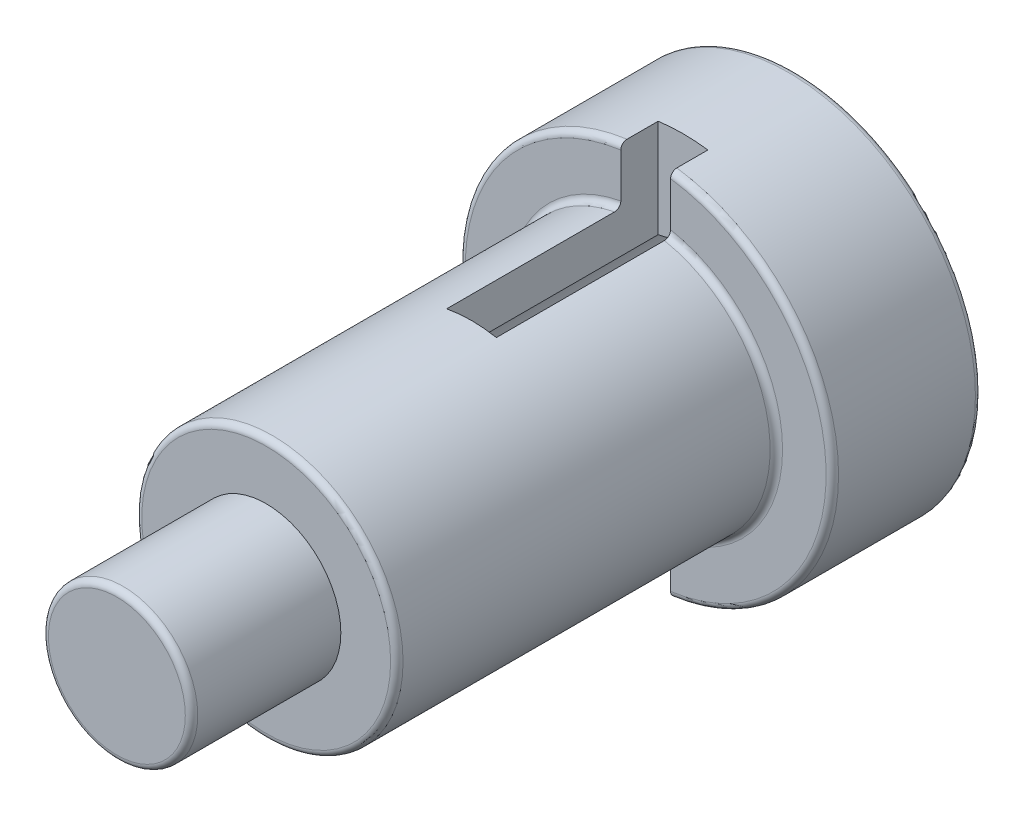
ISO-10303-21;
HEADER;
FILE_DESCRIPTION(('STEP AP214'),'2;1');
FILE_NAME('part.step','',(''),(''),'','','');
FILE_SCHEMA(('AUTOMOTIVE_DESIGN { 1 0 10303 214 1 1 1 1 }'));
ENDSEC;
DATA;
#1=APPLICATION_CONTEXT('core data for automotive mechanical design processes');
#2=APPLICATION_PROTOCOL_DEFINITION('international standard','automotive_design',2000,#1);
#3=PRODUCT_CONTEXT('',#1,'mechanical');
#4=PRODUCT('Part','Part','',(#3));
#5=PRODUCT_RELATED_PRODUCT_CATEGORY('part','',(#4));
#6=PRODUCT_DEFINITION_FORMATION('','',#4);
#7=PRODUCT_DEFINITION_CONTEXT('part definition',#1,'design');
#8=PRODUCT_DEFINITION('design','',#6,#7);
#9=PRODUCT_DEFINITION_SHAPE('','',#8);
#10=(LENGTH_UNIT() NAMED_UNIT(*) SI_UNIT(.MILLI.,.METRE.));
#11=(NAMED_UNIT(*) PLANE_ANGLE_UNIT() SI_UNIT($,.RADIAN.));
#12=(NAMED_UNIT(*) SI_UNIT($,.STERADIAN.) SOLID_ANGLE_UNIT());
#13=UNCERTAINTY_MEASURE_WITH_UNIT(LENGTH_MEASURE(1.E-05),#10,'distance_accuracy_value','');
#14=(GEOMETRIC_REPRESENTATION_CONTEXT(3) GLOBAL_UNCERTAINTY_ASSIGNED_CONTEXT((#13)) GLOBAL_UNIT_ASSIGNED_CONTEXT((#10,
#11,#12)) REPRESENTATION_CONTEXT('',''));
#15=CARTESIAN_POINT('',(0.,0.,0.));
#16=DIRECTION('',(0.,0.,1.));
#17=DIRECTION('',(1.,0.,0.));
#18=AXIS2_PLACEMENT_3D('',#15,#16,#17);
#19=CARTESIAN_POINT('',(0.,0.,-24.));
#20=DIRECTION('',(0.,0.,1.));
#21=DIRECTION('',(1.,0.,0.));
#22=AXIS2_PLACEMENT_3D('',#19,#20,#21);
#23=CYLINDRICAL_SURFACE('',#22,30.);
#24=CARTESIAN_POINT('',(0.,0.,-23.));
#25=DIRECTION('',(0.,0.,1.));
#26=DIRECTION('',(1.,0.,0.));
#27=AXIS2_PLACEMENT_3D('',#24,#25,#26);
#28=CIRCLE('',#27,30.);
#29=CARTESIAN_POINT('',(30.,0.,-23.));
#30=VERTEX_POINT('',#29);
#31=EDGE_CURVE('E259',#30,#30,#28,.T.);
#32=ORIENTED_EDGE('',*,*,#31,.T.);
#33=EDGE_LOOP('',(#32));
#34=FACE_BOUND('',#33,.T.);
#35=DIRECTION('',(0.,0.,1.));
#36=VECTOR('',#35,1.);
#37=CARTESIAN_POINT('',(-4.,-29.732137494637,-24.));
#38=LINE('',#37,#36);
#39=CARTESIAN_POINT('',(-4.,-29.732137494637,-1.));
#40=VERTEX_POINT('',#39);
#41=CARTESIAN_POINT('',(-4.,-29.732137494637,-6.));
#42=VERTEX_POINT('',#41);
#43=EDGE_CURVE('E208',#40,#42,#38,.F.);
#44=ORIENTED_EDGE('',*,*,#43,.F.);
#45=CARTESIAN_POINT('',(0.,0.,-1.));
#46=DIRECTION('',(0.,0.,1.));
#47=DIRECTION('',(1.,0.,0.));
#48=AXIS2_PLACEMENT_3D('',#45,#46,#47);
#49=CIRCLE('',#48,30.);
#50=CARTESIAN_POINT('',(-4.,29.732137494637,-1.));
#51=VERTEX_POINT('',#50);
#52=EDGE_CURVE('E438',#40,#51,#49,.F.);
#53=ORIENTED_EDGE('',*,*,#52,.T.);
#54=DIRECTION('',(0.,0.,1.));
#55=VECTOR('',#54,1.);
#56=CARTESIAN_POINT('',(-4.,29.732137494637,-24.));
#57=LINE('',#56,#55);
#58=CARTESIAN_POINT('',(-4.,29.732137494637,-6.));
#59=VERTEX_POINT('',#58);
#60=EDGE_CURVE('E214',#59,#51,#57,.T.);
#61=ORIENTED_EDGE('',*,*,#60,.F.);
#62=CARTESIAN_POINT('',(0.,0.,-6.00000000000001));
#63=DIRECTION('',(0.,0.,1.));
#64=DIRECTION('',(1.,0.,0.));
#65=AXIS2_PLACEMENT_3D('',#62,#63,#64);
#66=CIRCLE('',#65,30.);
#67=CARTESIAN_POINT('',(4.,29.732137494637,-6.00000000000001));
#68=VERTEX_POINT('',#67);
#69=EDGE_CURVE('E178',#59,#68,#66,.F.);
#70=ORIENTED_EDGE('',*,*,#69,.T.);
#71=DIRECTION('',(0.,0.,1.));
#72=VECTOR('',#71,1.);
#73=CARTESIAN_POINT('',(4.,29.732137494637,-24.));
#74=LINE('',#73,#72);
#75=CARTESIAN_POINT('',(4.,29.732137494637,-1.));
#76=VERTEX_POINT('',#75);
#77=EDGE_CURVE('E202',#68,#76,#74,.T.);
#78=ORIENTED_EDGE('',*,*,#77,.T.);
#79=CARTESIAN_POINT('',(0.,0.,-1.));
#80=DIRECTION('',(0.,0.,1.));
#81=DIRECTION('',(1.,0.,0.));
#82=AXIS2_PLACEMENT_3D('',#79,#80,#81);
#83=CIRCLE('',#82,30.);
#84=CARTESIAN_POINT('',(4.,-29.732137494637,-1.));
#85=VERTEX_POINT('',#84);
#86=EDGE_CURVE('E164',#76,#85,#83,.F.);
#87=ORIENTED_EDGE('',*,*,#86,.T.);
#88=DIRECTION('',(0.,0.,1.));
#89=VECTOR('',#88,1.);
#90=CARTESIAN_POINT('',(4.,-29.732137494637,-24.));
#91=LINE('',#90,#89);
#92=CARTESIAN_POINT('',(4.,-29.732137494637,-6.00000000000001));
#93=VERTEX_POINT('',#92);
#94=EDGE_CURVE('E157',#85,#93,#91,.F.);
#95=ORIENTED_EDGE('',*,*,#94,.T.);
#96=EDGE_CURVE('E160',#93,#42,#66,.F.);
#97=ORIENTED_EDGE('',*,*,#96,.T.);
#98=EDGE_LOOP('',(#44,#53,#61,#70,#78,#87,#95,#97));
#99=FACE_BOUND('',#98,.T.);
#100=ADVANCED_FACE('F39',(#34,#99),#23,.T.);
#101=CARTESIAN_POINT('',(0.,0.,0.));
#102=DIRECTION('',(0.,0.,1.));
#103=DIRECTION('',(1.,0.,0.));
#104=AXIS2_PLACEMENT_3D('',#101,#102,#103);
#105=PLANE('',#104);
#106=DIRECTION('',(0.,-1.,0.));
#107=VECTOR('',#106,1.);
#108=CARTESIAN_POINT('',(4.,0.,0.));
#109=LINE('',#108,#107);
#110=CARTESIAN_POINT('',(4.,-21.6333076527839,0.));
#111=VERTEX_POINT('',#110);
#112=CARTESIAN_POINT('',(4.,-28.7228132326901,0.));
#113=VERTEX_POINT('',#112);
#114=EDGE_CURVE('E168',#111,#113,#109,.T.);
#115=ORIENTED_EDGE('',*,*,#114,.T.);
#116=CARTESIAN_POINT('',(0.,0.,0.));
#117=DIRECTION('',(0.,0.,1.));
#118=DIRECTION('',(1.,0.,0.));
#119=AXIS2_PLACEMENT_3D('',#116,#117,#118);
#120=CIRCLE('',#119,29.);
#121=CARTESIAN_POINT('',(4.,28.7228132326901,0.));
#122=VERTEX_POINT('',#121);
#123=EDGE_CURVE('E437',#113,#122,#120,.T.);
#124=ORIENTED_EDGE('',*,*,#123,.T.);
#125=CARTESIAN_POINT('',(4.,21.6333076527839,0.));
#126=VERTEX_POINT('',#125);
#127=EDGE_CURVE('E198',#122,#126,#109,.T.);
#128=ORIENTED_EDGE('',*,*,#127,.T.);
#129=CARTESIAN_POINT('',(0.,0.,0.));
#130=DIRECTION('',(0.,0.,1.));
#131=DIRECTION('',(1.,0.,0.));
#132=AXIS2_PLACEMENT_3D('',#129,#130,#131);
#133=CIRCLE('',#132,22.);
#134=EDGE_CURVE('E435',#126,#111,#133,.F.);
#135=ORIENTED_EDGE('',*,*,#134,.T.);
#136=EDGE_LOOP('',(#115,#124,#128,#135));
#137=FACE_BOUND('',#136,.T.);
#138=ADVANCED_FACE('F353',(#137),#105,.T.);
#139=CARTESIAN_POINT('',(0.,0.,-24.));
#140=DIRECTION('',(0.,0.,1.));
#141=DIRECTION('',(1.,0.,0.));
#142=AXIS2_PLACEMENT_3D('',#139,#140,#141);
#143=PLANE('',#142);
#144=CARTESIAN_POINT('',(0.,0.,-24.));
#145=DIRECTION('',(0.,0.,1.));
#146=DIRECTION('',(1.,0.,0.));
#147=AXIS2_PLACEMENT_3D('',#144,#145,#146);
#148=CIRCLE('',#147,29.);
#149=CARTESIAN_POINT('',(29.,0.,-24.));
#150=VERTEX_POINT('',#149);
#151=EDGE_CURVE('E339',#150,#150,#148,.F.);
#152=ORIENTED_EDGE('',*,*,#151,.T.);
#153=EDGE_LOOP('',(#152));
#154=FACE_BOUND('',#153,.T.);
#155=CARTESIAN_POINT('',(0.,0.,-24.));
#156=DIRECTION('',(0.,0.,-1.));
#157=DIRECTION('',(-1.,0.,0.));
#158=AXIS2_PLACEMENT_3D('',#155,#156,#157);
#159=CIRCLE('',#158,14.5);
#160=CARTESIAN_POINT('',(-14.5,0.,-24.));
#161=VERTEX_POINT('',#160);
#162=EDGE_CURVE('E225',#161,#161,#159,.T.);
#163=ORIENTED_EDGE('',*,*,#162,.F.);
#164=EDGE_LOOP('',(#163));
#165=FACE_BOUND('',#164,.T.);
#166=ADVANCED_FACE('F359',(#154,#165),#143,.F.);
#167=DIRECTION('',(0.,-1.,0.));
#168=VECTOR('',#167,1.);
#169=CARTESIAN_POINT('',(-4.,0.,0.));
#170=LINE('',#169,#168);
#171=CARTESIAN_POINT('',(-4.,28.7228132326901,0.));
#172=VERTEX_POINT('',#171);
#173=CARTESIAN_POINT('',(-4.,21.6333076527839,0.));
#174=VERTEX_POINT('',#173);
#175=EDGE_CURVE('E209',#172,#174,#170,.T.);
#176=ORIENTED_EDGE('',*,*,#175,.F.);
#177=CARTESIAN_POINT('',(0.,0.,0.));
#178=DIRECTION('',(0.,0.,1.));
#179=DIRECTION('',(1.,0.,0.));
#180=AXIS2_PLACEMENT_3D('',#177,#178,#179);
#181=CIRCLE('',#180,29.);
#182=CARTESIAN_POINT('',(-4.,-28.7228132326901,0.));
#183=VERTEX_POINT('',#182);
#184=EDGE_CURVE('E248',#172,#183,#181,.T.);
#185=ORIENTED_EDGE('',*,*,#184,.T.);
#186=CARTESIAN_POINT('',(-4.,-21.6333076527839,0.));
#187=VERTEX_POINT('',#186);
#188=EDGE_CURVE('E205',#187,#183,#170,.T.);
#189=ORIENTED_EDGE('',*,*,#188,.F.);
#190=CARTESIAN_POINT('',(0.,0.,0.));
#191=DIRECTION('',(0.,0.,1.));
#192=DIRECTION('',(1.,0.,0.));
#193=AXIS2_PLACEMENT_3D('',#190,#191,#192);
#194=CIRCLE('',#193,22.);
#195=EDGE_CURVE('E246',#187,#174,#194,.F.);
#196=ORIENTED_EDGE('',*,*,#195,.T.);
#197=EDGE_LOOP('',(#176,#185,#189,#196));
#198=FACE_BOUND('',#197,.T.);
#199=ADVANCED_FACE('F362',(#198),#105,.T.);
#200=CARTESIAN_POINT('',(0.,0.,61.));
#201=DIRECTION('',(0.,0.,-1.));
#202=DIRECTION('',(-1.,0.,0.));
#203=AXIS2_PLACEMENT_3D('',#200,#201,#202);
#204=CYLINDRICAL_SURFACE('',#203,21.);
#205=CARTESIAN_POINT('',(0.,0.,60.));
#206=DIRECTION('',(0.,0.,1.));
#207=DIRECTION('',(1.,0.,0.));
#208=AXIS2_PLACEMENT_3D('',#205,#206,#207);
#209=CIRCLE('',#208,21.);
#210=CARTESIAN_POINT('',(21.,0.,60.));
#211=VERTEX_POINT('',#210);
#212=EDGE_CURVE('E460',#211,#211,#209,.F.);
#213=ORIENTED_EDGE('',*,*,#212,.T.);
#214=EDGE_LOOP('',(#213));
#215=FACE_BOUND('',#214,.T.);
#216=DIRECTION('',(0.,0.,-1.));
#217=VECTOR('',#216,1.);
#218=CARTESIAN_POINT('',(-3.99999999999999,20.6155281280883,61.));
#219=LINE('',#218,#217);
#220=CARTESIAN_POINT('',(-4.,20.6155281280883,28.));
#221=VERTEX_POINT('',#220);
#222=CARTESIAN_POINT('',(-3.99999999999999,20.6155281280883,1.00000000000001));
#223=VERTEX_POINT('',#222);
#224=EDGE_CURVE('E211',#221,#223,#219,.T.);
#225=ORIENTED_EDGE('',*,*,#224,.T.);
#226=CARTESIAN_POINT('',(0.,0.,1.));
#227=DIRECTION('',(0.,0.,1.));
#228=DIRECTION('',(1.,0.,0.));
#229=AXIS2_PLACEMENT_3D('',#226,#227,#228);
#230=CIRCLE('',#229,21.);
#231=CARTESIAN_POINT('',(-3.99999999999999,-20.6155281280883,1.00000000000001));
#232=VERTEX_POINT('',#231);
#233=EDGE_CURVE('E453',#223,#232,#230,.T.);
#234=ORIENTED_EDGE('',*,*,#233,.T.);
#235=DIRECTION('',(0.,0.,-1.));
#236=VECTOR('',#235,1.);
#237=CARTESIAN_POINT('',(-3.99999999999999,-20.6155281280883,61.));
#238=LINE('',#237,#236);
#239=CARTESIAN_POINT('',(-4.,-20.6155281280883,28.));
#240=VERTEX_POINT('',#239);
#241=EDGE_CURVE('E177',#232,#240,#238,.F.);
#242=ORIENTED_EDGE('',*,*,#241,.T.);
#243=CARTESIAN_POINT('',(0.,0.,28.));
#244=DIRECTION('',(0.,0.,1.));
#245=DIRECTION('',(1.,0.,0.));
#246=AXIS2_PLACEMENT_3D('',#243,#244,#245);
#247=CIRCLE('',#246,21.);
#248=CARTESIAN_POINT('',(4.,-20.6155281280883,28.));
#249=VERTEX_POINT('',#248);
#250=EDGE_CURVE('E217',#240,#249,#247,.T.);
#251=ORIENTED_EDGE('',*,*,#250,.T.);
#252=DIRECTION('',(0.,0.,-1.));
#253=VECTOR('',#252,1.);
#254=CARTESIAN_POINT('',(3.99999999999999,-20.6155281280883,61.));
#255=LINE('',#254,#253);
#256=CARTESIAN_POINT('',(3.99999999999999,-20.6155281280883,1.00000000000001));
#257=VERTEX_POINT('',#256);
#258=EDGE_CURVE('E194',#257,#249,#255,.F.);
#259=ORIENTED_EDGE('',*,*,#258,.F.);
#260=CARTESIAN_POINT('',(0.,0.,1.));
#261=DIRECTION('',(0.,0.,1.));
#262=DIRECTION('',(1.,0.,0.));
#263=AXIS2_PLACEMENT_3D('',#260,#261,#262);
#264=CIRCLE('',#263,21.);
#265=CARTESIAN_POINT('',(3.99999999999999,20.6155281280883,1.00000000000001));
#266=VERTEX_POINT('',#265);
#267=EDGE_CURVE('E432',#257,#266,#264,.T.);
#268=ORIENTED_EDGE('',*,*,#267,.T.);
#269=DIRECTION('',(0.,0.,-1.));
#270=VECTOR('',#269,1.);
#271=CARTESIAN_POINT('',(3.99999999999999,20.6155281280883,61.));
#272=LINE('',#271,#270);
#273=CARTESIAN_POINT('',(3.99999999999999,20.6155281280883,28.));
#274=VERTEX_POINT('',#273);
#275=EDGE_CURVE('E167',#274,#266,#272,.T.);
#276=ORIENTED_EDGE('',*,*,#275,.F.);
#277=EDGE_CURVE('E220',#274,#221,#247,.T.);
#278=ORIENTED_EDGE('',*,*,#277,.T.);
#279=EDGE_LOOP('',(#225,#234,#242,#251,#259,#268,#276,#278));
#280=FACE_BOUND('',#279,.T.);
#281=ADVANCED_FACE('F366',(#215,#280),#204,.T.);
#282=CARTESIAN_POINT('',(0.,0.,61.));
#283=DIRECTION('',(0.,0.,1.));
#284=DIRECTION('',(1.,0.,0.));
#285=AXIS2_PLACEMENT_3D('',#282,#283,#284);
#286=PLANE('',#285);
#287=CARTESIAN_POINT('',(0.,0.,61.));
#288=DIRECTION('',(0.,0.,1.));
#289=DIRECTION('',(1.,0.,0.));
#290=AXIS2_PLACEMENT_3D('',#287,#288,#289);
#291=CIRCLE('',#290,20.);
#292=CARTESIAN_POINT('',(20.,0.,61.));
#293=VERTEX_POINT('',#292);
#294=EDGE_CURVE('E455',#293,#293,#291,.T.);
#295=ORIENTED_EDGE('',*,*,#294,.T.);
#296=EDGE_LOOP('',(#295));
#297=FACE_BOUND('',#296,.T.);
#298=CARTESIAN_POINT('',(0.,0.,61.));
#299=DIRECTION('',(0.,0.,1.));
#300=DIRECTION('',(1.,0.,0.));
#301=AXIS2_PLACEMENT_3D('',#298,#299,#300);
#302=CIRCLE('',#301,12.);
#303=CARTESIAN_POINT('',(12.,0.,61.));
#304=VERTEX_POINT('',#303);
#305=EDGE_CURVE('E224',#304,#304,#302,.T.);
#306=ORIENTED_EDGE('',*,*,#305,.F.);
#307=EDGE_LOOP('',(#306));
#308=FACE_BOUND('',#307,.T.);
#309=ADVANCED_FACE('F373',(#297,#308),#286,.T.);
#310=CARTESIAN_POINT('',(0.,0.,85.));
#311=DIRECTION('',(0.,0.,-1.));
#312=DIRECTION('',(-1.,0.,0.));
#313=AXIS2_PLACEMENT_3D('',#310,#311,#312);
#314=CYLINDRICAL_SURFACE('',#313,12.);
#315=CARTESIAN_POINT('',(0.,0.,84.));
#316=DIRECTION('',(0.,0.,1.));
#317=DIRECTION('',(1.,0.,0.));
#318=AXIS2_PLACEMENT_3D('',#315,#316,#317);
#319=CIRCLE('',#318,12.);
#320=CARTESIAN_POINT('',(12.,0.,84.));
#321=VERTEX_POINT('',#320);
#322=EDGE_CURVE('E294',#321,#321,#319,.F.);
#323=ORIENTED_EDGE('',*,*,#322,.T.);
#324=EDGE_LOOP('',(#323));
#325=FACE_BOUND('',#324,.T.);
#326=ORIENTED_EDGE('',*,*,#305,.T.);
#327=EDGE_LOOP('',(#326));
#328=FACE_BOUND('',#327,.T.);
#329=ADVANCED_FACE('F377',(#325,#328),#314,.T.);
#330=CARTESIAN_POINT('',(0.,0.,85.));
#331=DIRECTION('',(0.,0.,1.));
#332=DIRECTION('',(1.,0.,0.));
#333=AXIS2_PLACEMENT_3D('',#330,#331,#332);
#334=PLANE('',#333);
#335=CARTESIAN_POINT('',(0.,0.,85.));
#336=DIRECTION('',(0.,0.,1.));
#337=DIRECTION('',(1.,0.,0.));
#338=AXIS2_PLACEMENT_3D('',#335,#336,#337);
#339=CIRCLE('',#338,11.);
#340=CARTESIAN_POINT('',(11.,0.,85.));
#341=VERTEX_POINT('',#340);
#342=EDGE_CURVE('E458',#341,#341,#339,.T.);
#343=ORIENTED_EDGE('',*,*,#342,.T.);
#344=EDGE_LOOP('',(#343));
#345=FACE_BOUND('',#344,.T.);
#346=ADVANCED_FACE('F381',(#345),#334,.T.);
#347=CARTESIAN_POINT('',(0.,0.,46.));
#348=DIRECTION('',(0.,0.,-1.));
#349=DIRECTION('',(-1.,0.,0.));
#350=AXIS2_PLACEMENT_3D('',#347,#348,#349);
#351=CYLINDRICAL_SURFACE('',#350,14.5);
#352=DIRECTION('',(0.,0.,-1.));
#353=VECTOR('',#352,1.);
#354=CARTESIAN_POINT('',(-3.99999999999999,13.9373598647664,46.));
#355=LINE('',#354,#353);
#356=CARTESIAN_POINT('',(-4.,13.9373598647664,-6.));
#357=VERTEX_POINT('',#356);
#358=CARTESIAN_POINT('',(-4.,13.9373598647664,28.));
#359=VERTEX_POINT('',#358);
#360=EDGE_CURVE('E243',#357,#359,#355,.F.);
#361=ORIENTED_EDGE('',*,*,#360,.T.);
#362=CARTESIAN_POINT('',(0.,0.,28.));
#363=DIRECTION('',(0.,0.,1.));
#364=DIRECTION('',(1.,0.,0.));
#365=AXIS2_PLACEMENT_3D('',#362,#363,#364);
#366=CIRCLE('',#365,14.5);
#367=CARTESIAN_POINT('',(4.,13.9373598647664,28.));
#368=VERTEX_POINT('',#367);
#369=EDGE_CURVE('E241',#359,#368,#366,.F.);
#370=ORIENTED_EDGE('',*,*,#369,.T.);
#371=DIRECTION('',(0.,0.,-1.));
#372=VECTOR('',#371,1.);
#373=CARTESIAN_POINT('',(3.99999999999999,13.9373598647664,46.));
#374=LINE('',#373,#372);
#375=CARTESIAN_POINT('',(3.99999999999999,13.9373598647664,-6.00000000000001));
#376=VERTEX_POINT('',#375);
#377=EDGE_CURVE('E240',#376,#368,#374,.F.);
#378=ORIENTED_EDGE('',*,*,#377,.F.);
#379=CARTESIAN_POINT('',(0.,0.,-6.));
#380=DIRECTION('',(0.,0.,1.));
#381=DIRECTION('',(1.,0.,0.));
#382=AXIS2_PLACEMENT_3D('',#379,#380,#381);
#383=CIRCLE('',#382,14.5);
#384=EDGE_CURVE('E234',#357,#376,#383,.F.);
#385=ORIENTED_EDGE('',*,*,#384,.F.);
#386=EDGE_LOOP('',(#361,#370,#378,#385));
#387=FACE_BOUND('',#386,.T.);
#388=DIRECTION('',(0.,0.,-1.));
#389=VECTOR('',#388,1.);
#390=CARTESIAN_POINT('',(3.99999999999999,-13.9373598647664,46.));
#391=LINE('',#390,#389);
#392=CARTESIAN_POINT('',(3.99999999999999,-13.9373598647664,28.));
#393=VERTEX_POINT('',#392);
#394=CARTESIAN_POINT('',(4.,-13.9373598647664,-6.00000000000001));
#395=VERTEX_POINT('',#394);
#396=EDGE_CURVE('E182',#393,#395,#391,.T.);
#397=ORIENTED_EDGE('',*,*,#396,.F.);
#398=CARTESIAN_POINT('',(-4.,-13.9373598647664,28.));
#399=VERTEX_POINT('',#398);
#400=EDGE_CURVE('E237',#393,#399,#366,.F.);
#401=ORIENTED_EDGE('',*,*,#400,.T.);
#402=DIRECTION('',(0.,0.,-1.));
#403=VECTOR('',#402,1.);
#404=CARTESIAN_POINT('',(-3.99999999999999,-13.9373598647664,46.));
#405=LINE('',#404,#403);
#406=CARTESIAN_POINT('',(-4.,-13.9373598647664,-6.));
#407=VERTEX_POINT('',#406);
#408=EDGE_CURVE('E233',#399,#407,#405,.T.);
#409=ORIENTED_EDGE('',*,*,#408,.T.);
#410=EDGE_CURVE('E231',#395,#407,#383,.F.);
#411=ORIENTED_EDGE('',*,*,#410,.F.);
#412=EDGE_LOOP('',(#397,#401,#409,#411));
#413=FACE_BOUND('',#412,.T.);
#414=CARTESIAN_POINT('',(0.,0.,46.));
#415=DIRECTION('',(0.,0.,-1.));
#416=DIRECTION('',(-1.,0.,0.));
#417=AXIS2_PLACEMENT_3D('',#414,#415,#416);
#418=CIRCLE('',#417,14.5);
#419=CARTESIAN_POINT('',(-14.5,0.,46.));
#420=VERTEX_POINT('',#419);
#421=EDGE_CURVE('E221',#420,#420,#418,.T.);
#422=ORIENTED_EDGE('',*,*,#421,.F.);
#423=EDGE_LOOP('',(#422));
#424=FACE_BOUND('',#423,.T.);
#425=ORIENTED_EDGE('',*,*,#162,.T.);
#426=EDGE_LOOP('',(#425));
#427=FACE_BOUND('',#426,.T.);
#428=ADVANCED_FACE('F385',(#387,#413,#424,#427),#351,.F.);
#429=CARTESIAN_POINT('',(0.,0.,46.));
#430=DIRECTION('',(0.,0.,-1.));
#431=DIRECTION('',(-1.,0.,0.));
#432=AXIS2_PLACEMENT_3D('',#429,#430,#431);
#433=PLANE('',#432);
#434=ORIENTED_EDGE('',*,*,#421,.T.);
#435=EDGE_LOOP('',(#434));
#436=FACE_BOUND('',#435,.T.);
#437=ADVANCED_FACE('F388',(#436),#433,.T.);
#438=CARTESIAN_POINT('',(4.,-30.,-6.00000000000001));
#439=DIRECTION('',(-1.,0.,0.));
#440=DIRECTION('',(0.,0.,1.));
#441=AXIS2_PLACEMENT_3D('',#438,#439,#440);
#442=PLANE('',#441);
#443=ORIENTED_EDGE('',*,*,#94,.F.);
#444=CARTESIAN_POINT('',(4.,-29.732137494637,-1.));
#445=CARTESIAN_POINT('',(4.,-29.7321374366135,-0.97204951542763));
#446=CARTESIAN_POINT('',(4.,-29.7309543400118,-0.944112483166112));
#447=CARTESIAN_POINT('',(4.,-29.7262353589258,-0.888439699349765));
#448=CARTESIAN_POINT('',(4.,-29.7226996280369,-0.860703934774352));
#449=CARTESIAN_POINT('',(4.,-29.708601006192,-0.778158940705944));
#450=CARTESIAN_POINT('',(4.,-29.6945465689787,-0.723904839733144));
#451=CARTESIAN_POINT('',(4.,-29.6575365592461,-0.618531312502427));
#452=CARTESIAN_POINT('',(4.,-29.6345774679278,-0.567413134708682));
#453=CARTESIAN_POINT('',(4.,-29.5804365472177,-0.469735549975954));
#454=CARTESIAN_POINT('',(4.,-29.5492555952093,-0.42317565733297));
#455=CARTESIAN_POINT('',(4.,-29.4794435402856,-0.33573423302757));
#456=CARTESIAN_POINT('',(4.,-29.4407843178926,-0.294875168282902));
#457=CARTESIAN_POINT('',(4.,-29.3571982925579,-0.220152936194437));
#458=CARTESIAN_POINT('',(4.,-29.312270181376,-0.186291232783204));
#459=CARTESIAN_POINT('',(4.,-29.2170185540568,-0.126221921197001));
#460=CARTESIAN_POINT('',(4.,-29.1666516737159,-0.100083153755595));
#461=CARTESIAN_POINT('',(4.,-29.0622777551616,-0.0565624556456802));
#462=CARTESIAN_POINT('',(4.,-29.0082723655661,-0.0391765888697486));
#463=CARTESIAN_POINT('',(4.,-28.9154618499218,-0.0176216006275535));
#464=CARTESIAN_POINT('',(4.,-28.877203759583,-0.0110171887501361));
#465=CARTESIAN_POINT('',(4.,-28.8002397216333,-0.00220672378156486));
#466=CARTESIAN_POINT('',(4.,-28.7615344892979,5.57877114397327E-06));
#467=CARTESIAN_POINT('',(4.,-28.7228132326901,0.));
#468=B_SPLINE_CURVE_WITH_KNOTS('',3,(#444,#445,#446,#447,#448,#449,#450,#451,#452,#453,#454,
#455,#456,#457,#458,#459,#460,#461,#462,#463,#464,#465,#466,#467),.UNSPECIFIED.,.F.,.F.,(4,2,2,
2,2,2,2,2,2,2,2,4),(0.,0.0837997370008999,0.167594003540893,0.334865132116365,0.502202427682048,
0.669521873320958,0.837483145293504,1.00547952129745,1.17493108820473,1.34430638591936,
1.46054128540046,1.57661067724206),.UNSPECIFIED.);
#469=EDGE_CURVE('E333',#85,#113,#468,.T.);
#470=ORIENTED_EDGE('',*,*,#469,.T.);
#471=ORIENTED_EDGE('',*,*,#114,.F.);
#472=CARTESIAN_POINT('',(4.,-21.6333076527839,0.));
#473=CARTESIAN_POINT('',(4.,-21.5753232453707,-4.4162162276955E-05));
#474=CARTESIAN_POINT('',(4.,-21.5173487868628,0.00487409266691115));
#475=CARTESIAN_POINT('',(4.,-21.4030485676539,0.0243071475803015));
#476=CARTESIAN_POINT('',(4.,-21.3467222936255,0.0388189258124308));
#477=CARTESIAN_POINT('',(4.,-21.2372750759097,0.0771228904594404));
#478=CARTESIAN_POINT('',(4.,-21.184156123809,0.100920776020845));
#479=CARTESIAN_POINT('',(4.,-21.0827197485733,0.157150227858943));
#480=CARTESIAN_POINT('',(4.,-21.0344008961217,0.189579213423537));
#481=CARTESIAN_POINT('',(4.,-20.944322176885,0.261940806583689));
#482=CARTESIAN_POINT('',(4.,-20.9025176160689,0.301817742075842));
#483=CARTESIAN_POINT('',(4.,-20.8263248815385,0.38814046537749));
#484=CARTESIAN_POINT('',(4.,-20.7919378405238,0.434587254652361));
#485=CARTESIAN_POINT('',(4.,-20.7321802255254,0.531902558197995));
#486=CARTESIAN_POINT('',(4.,-20.7066709615556,0.58268601209567));
#487=CARTESIAN_POINT('',(4.,-20.6647212320268,0.687849455142706));
#488=CARTESIAN_POINT('',(4.,-20.6482730568551,0.742226342562414));
#489=CARTESIAN_POINT('',(4.,-20.6296071700464,0.83085393058384));
#490=CARTESIAN_POINT('',(4.,-20.6243306295745,0.864489820286095));
#491=CARTESIAN_POINT('',(4.,-20.6172920421426,0.932078500354529));
#492=CARTESIAN_POINT('',(4.,-20.6155249736017,0.96603076798616));
#493=CARTESIAN_POINT('',(4.,-20.6155281280883,1.));
#494=B_SPLINE_CURVE_WITH_KNOTS('',3,(#472,#473,#474,#475,#476,#477,#478,#479,#480,#481,#482,
#483,#484,#485,#486,#487,#488,#489,#490,#491,#492,#493),.UNSPECIFIED.,.F.,.F.,(4,2,2,2,2,2,2,2,
2,2,4),(0.,0.173731872667597,0.34740904780511,0.521192981608005,0.694925012010079,
0.867406936733402,1.03991518185953,1.20959279012763,1.37912580461606,1.48110046589298,
1.58292910976135),.UNSPECIFIED.);
#495=EDGE_CURVE('E11',#111,#257,#494,.T.);
#496=ORIENTED_EDGE('',*,*,#495,.T.);
#497=ORIENTED_EDGE('',*,*,#258,.T.);
#498=DIRECTION('',(0.,1.,0.));
#499=VECTOR('',#498,1.);
#500=CARTESIAN_POINT('',(4.,-30.,28.));
#501=LINE('',#500,#499);
#502=EDGE_CURVE('E189',#249,#393,#501,.T.);
#503=ORIENTED_EDGE('',*,*,#502,.T.);
#504=ORIENTED_EDGE('',*,*,#396,.T.);
#505=DIRECTION('',(0.,1.,0.));
#506=VECTOR('',#505,1.);
#507=CARTESIAN_POINT('',(4.,-30.,-6.00000000000001));
#508=LINE('',#507,#506);
#509=EDGE_CURVE('E173',#93,#395,#508,.T.);
#510=ORIENTED_EDGE('',*,*,#509,.F.);
#511=EDGE_LOOP('',(#443,#470,#471,#496,#497,#503,#504,#510));
#512=FACE_BOUND('',#511,.T.);
#513=ADVANCED_FACE('F180',(#512),#442,.T.);
#514=CARTESIAN_POINT('',(-4.,-30.,-6.));
#515=DIRECTION('',(0.,0.,1.));
#516=DIRECTION('',(1.,0.,0.));
#517=AXIS2_PLACEMENT_3D('',#514,#515,#516);
#518=PLANE('',#517);
#519=ORIENTED_EDGE('',*,*,#509,.T.);
#520=ORIENTED_EDGE('',*,*,#410,.T.);
#521=DIRECTION('',(0.,1.,0.));
#522=VECTOR('',#521,1.);
#523=CARTESIAN_POINT('',(-4.,-30.,-6.));
#524=LINE('',#523,#522);
#525=EDGE_CURVE('E176',#42,#407,#524,.T.);
#526=ORIENTED_EDGE('',*,*,#525,.F.);
#527=ORIENTED_EDGE('',*,*,#96,.F.);
#528=EDGE_LOOP('',(#519,#520,#526,#527));
#529=FACE_BOUND('',#528,.T.);
#530=ADVANCED_FACE('F172',(#529),#518,.T.);
#531=CARTESIAN_POINT('',(-4.,-30.,-6.));
#532=DIRECTION('',(-1.,0.,0.));
#533=DIRECTION('',(0.,0.,1.));
#534=AXIS2_PLACEMENT_3D('',#531,#532,#533);
#535=PLANE('',#534);
#536=ORIENTED_EDGE('',*,*,#188,.T.);
#537=CARTESIAN_POINT('',(-4.,-28.7228132326901,0.));
#538=CARTESIAN_POINT('',(-4.,-28.7514082784131,-3.34964408770888E-07));
#539=CARTESIAN_POINT('',(-4.,-28.7799897229927,-0.0012039252505549));
#540=CARTESIAN_POINT('',(-4.,-28.8369497837622,-0.00600693362793276));
#541=CARTESIAN_POINT('',(-4.,-28.8653284052245,-0.00960628921004076));
#542=CARTESIAN_POINT('',(-4.,-28.9498217758729,-0.023968972998716));
#543=CARTESIAN_POINT('',(-4.,-29.005373168745,-0.0382969863215326));
#544=CARTESIAN_POINT('',(-4.,-29.1132841556116,-0.0760865903992207));
#545=CARTESIAN_POINT('',(-4.,-29.1656418539533,-0.0995535458156127));
#546=CARTESIAN_POINT('',(-4.,-29.2656445036283,-0.154980372677166));
#547=CARTESIAN_POINT('',(-4.,-29.3132906769966,-0.186938033905643));
#548=CARTESIAN_POINT('',(-4.,-29.4022741032599,-0.258299024883554));
#549=CARTESIAN_POINT('',(-4.,-29.4436393484434,-0.297667455428875));
#550=CARTESIAN_POINT('',(-4.,-29.5191108423075,-0.382855845992966));
#551=CARTESIAN_POINT('',(-4.,-29.553215796858,-0.42867695377226));
#552=CARTESIAN_POINT('',(-4.,-29.6128697276967,-0.525031072231363));
#553=CARTESIAN_POINT('',(-4.,-29.6384901243889,-0.575519922060439));
#554=CARTESIAN_POINT('',(-4.,-29.6807978432178,-0.680093910314817));
#555=CARTESIAN_POINT('',(-4.,-29.6974915565267,-0.734176444522141));
#556=CARTESIAN_POINT('',(-4.,-29.7170067479964,-0.823864528766574));
#557=CARTESIAN_POINT('',(-4.,-29.7226774573062,-0.858875635144847));
#558=CARTESIAN_POINT('',(-4.,-29.7302420485448,-0.929252608375291));
#559=CARTESIAN_POINT('',(-4.,-29.7321413327245,-0.964617894754798));
#560=CARTESIAN_POINT('',(-4.,-29.732137494637,-1.));
#561=B_SPLINE_CURVE_WITH_KNOTS('',3,(#537,#538,#539,#540,#541,#542,#543,#544,#545,#546,#547,
#548,#549,#550,#551,#552,#553,#554,#555,#556,#557,#558,#559,#560),.UNSPECIFIED.,.F.,.F.,(4,2,2,
2,2,2,2,2,2,2,2,4),(0.,0.0857327389759431,0.171463241143324,0.34268984100342,0.514017104671453,
0.685299813739905,0.855795221984613,1.02632099524642,1.19537251239152,1.36430283234938,
1.47051765997627,1.57658023368306),.UNSPECIFIED.);
#562=EDGE_CURVE('E251',#183,#40,#561,.T.);
#563=ORIENTED_EDGE('',*,*,#562,.T.);
#564=ORIENTED_EDGE('',*,*,#43,.T.);
#565=ORIENTED_EDGE('',*,*,#525,.T.);
#566=ORIENTED_EDGE('',*,*,#408,.F.);
#567=DIRECTION('',(0.,1.,0.));
#568=VECTOR('',#567,1.);
#569=CARTESIAN_POINT('',(-4.,-30.,28.));
#570=LINE('',#569,#568);
#571=EDGE_CURVE('E196',#240,#399,#570,.T.);
#572=ORIENTED_EDGE('',*,*,#571,.F.);
#573=ORIENTED_EDGE('',*,*,#241,.F.);
#574=CARTESIAN_POINT('',(-3.99999999999999,-20.6155281280883,1.));
#575=CARTESIAN_POINT('',(-4.,-20.6155280283011,0.972233668529445));
#576=CARTESIAN_POINT('',(-4.,-20.616706911751,0.944480777755551));
#577=CARTESIAN_POINT('',(-4.,-20.6214080261642,0.889176597704878));
#578=CARTESIAN_POINT('',(-4.,-20.6249300550317,0.861625291248668));
#579=CARTESIAN_POINT('',(-4.,-20.6389688919666,0.779647412325973));
#580=CARTESIAN_POINT('',(-4.,-20.6529585979397,0.725774826879668));
#581=CARTESIAN_POINT('',(-4.,-20.6897675245638,0.621152312177647));
#582=CARTESIAN_POINT('',(-4.,-20.7125893351597,0.570403303950513));
#583=CARTESIAN_POINT('',(-4.,-20.7663610091389,0.473409917771727));
#584=CARTESIAN_POINT('',(-4.,-20.7973106760903,0.427165430993012));
#585=CARTESIAN_POINT('',(-4.,-20.8666994880002,0.340067882765158));
#586=CARTESIAN_POINT('',(-4.,-20.9051979457993,0.299262123022709));
#587=CARTESIAN_POINT('',(-4.,-20.9884030397046,0.224552408569049));
#588=CARTESIAN_POINT('',(-4.,-21.0331110950452,0.190650036042157));
#589=CARTESIAN_POINT('',(-4.,-21.1282845503379,0.130096144934395));
#590=CARTESIAN_POINT('',(-4.,-21.1788363217203,0.103580513115786));
#591=CARTESIAN_POINT('',(-4.,-21.2836204666212,0.0592755644772761));
#592=CARTESIAN_POINT('',(-4.,-21.3378515237298,0.0414831451316893));
#593=CARTESIAN_POINT('',(-4.,-21.4324732371961,0.0188806799230216));
#594=CARTESIAN_POINT('',(-4.,-21.4723386771858,0.0118054393748727));
#595=CARTESIAN_POINT('',(-4.,-21.5525671576728,0.00236516951719373));
#596=CARTESIAN_POINT('',(-4.,-21.5929294304395,-6.38592949736081E-06));
#597=CARTESIAN_POINT('',(-4.,-21.6333076527839,0.));
#598=B_SPLINE_CURVE_WITH_KNOTS('',3,(#574,#575,#576,#577,#578,#579,#580,#581,#582,#583,#584,
#585,#586,#587,#588,#589,#590,#591,#592,#593,#594,#595,#596,#597),.UNSPECIFIED.,.F.,.F.,(4,2,2,
2,2,2,2,2,2,2,2,4),(0.,0.0832473572786416,0.166487535420858,0.332606433975099,0.498774082542638,
0.664937715583799,0.832463418642364,1.00002747373552,1.17049636051416,1.34090457372028,
1.4621070939874,1.58314133361346),.UNSPECIFIED.);
#599=EDGE_CURVE('E286',#232,#187,#598,.T.);
#600=ORIENTED_EDGE('',*,*,#599,.T.);
#601=EDGE_LOOP('',(#536,#563,#564,#565,#566,#572,#573,#600));
#602=FACE_BOUND('',#601,.T.);
#603=ADVANCED_FACE('F272',(#602),#535,.F.);
#604=CARTESIAN_POINT('',(-4.,-30.,28.));
#605=DIRECTION('',(0.,0.,1.));
#606=DIRECTION('',(1.,0.,0.));
#607=AXIS2_PLACEMENT_3D('',#604,#605,#606);
#608=PLANE('',#607);
#609=ORIENTED_EDGE('',*,*,#571,.T.);
#610=ORIENTED_EDGE('',*,*,#400,.F.);
#611=ORIENTED_EDGE('',*,*,#502,.F.);
#612=ORIENTED_EDGE('',*,*,#250,.F.);
#613=EDGE_LOOP('',(#609,#610,#611,#612));
#614=FACE_BOUND('',#613,.T.);
#615=ADVANCED_FACE('F407',(#614),#608,.F.);
#616=EDGE_CURVE('E192',#368,#274,#501,.T.);
#617=ORIENTED_EDGE('',*,*,#616,.F.);
#618=ORIENTED_EDGE('',*,*,#369,.F.);
#619=EDGE_CURVE('E430',#359,#221,#570,.T.);
#620=ORIENTED_EDGE('',*,*,#619,.T.);
#621=ORIENTED_EDGE('',*,*,#277,.F.);
#622=EDGE_LOOP('',(#617,#618,#620,#621));
#623=FACE_BOUND('',#622,.T.);
#624=ADVANCED_FACE('F270',(#623),#608,.F.);
#625=ORIENTED_EDGE('',*,*,#60,.T.);
#626=CARTESIAN_POINT('',(-4.,29.732137494637,-1.));
#627=CARTESIAN_POINT('',(-4.,29.7321374366135,-0.97204951542763));
#628=CARTESIAN_POINT('',(-4.,29.7309543400118,-0.944112483166112));
#629=CARTESIAN_POINT('',(-4.,29.7262353589258,-0.888439699349765));
#630=CARTESIAN_POINT('',(-4.,29.7226996280369,-0.860703934774352));
#631=CARTESIAN_POINT('',(-4.,29.708601006192,-0.778158940705944));
#632=CARTESIAN_POINT('',(-4.,29.6945465689787,-0.723904839733144));
#633=CARTESIAN_POINT('',(-4.,29.6575365592461,-0.618531312502427));
#634=CARTESIAN_POINT('',(-4.,29.6345774679278,-0.567413134708682));
#635=CARTESIAN_POINT('',(-4.,29.5804365472177,-0.469735549975954));
#636=CARTESIAN_POINT('',(-4.,29.5492555952093,-0.42317565733297));
#637=CARTESIAN_POINT('',(-4.,29.4794435402856,-0.33573423302757));
#638=CARTESIAN_POINT('',(-4.,29.4407843178926,-0.294875168282902));
#639=CARTESIAN_POINT('',(-4.,29.3571982925579,-0.220152936194437));
#640=CARTESIAN_POINT('',(-4.,29.312270181376,-0.186291232783204));
#641=CARTESIAN_POINT('',(-4.,29.2170185540568,-0.126221921197001));
#642=CARTESIAN_POINT('',(-4.,29.1666516737159,-0.100083153755595));
#643=CARTESIAN_POINT('',(-4.,29.0622777551616,-0.0565624556456802));
#644=CARTESIAN_POINT('',(-4.,29.0082723655661,-0.0391765888697486));
#645=CARTESIAN_POINT('',(-4.,28.9154618499218,-0.0176216006275535));
#646=CARTESIAN_POINT('',(-4.,28.877203759583,-0.0110171887501361));
#647=CARTESIAN_POINT('',(-4.,28.8002397216333,-0.00220672378156486));
#648=CARTESIAN_POINT('',(-4.,28.7615344892979,5.57877114397327E-06));
#649=CARTESIAN_POINT('',(-4.,28.7228132326901,0.));
#650=B_SPLINE_CURVE_WITH_KNOTS('',3,(#626,#627,#628,#629,#630,#631,#632,#633,#634,#635,#636,
#637,#638,#639,#640,#641,#642,#643,#644,#645,#646,#647,#648,#649),.UNSPECIFIED.,.F.,.F.,(4,2,2,
2,2,2,2,2,2,2,2,4),(0.,0.0837997370008999,0.167594003540893,0.334865132116365,0.502202427682048,
0.669521873320958,0.837483145293504,1.00547952129745,1.17493108820473,1.34430638591936,
1.46054128540046,1.57661067724206),.UNSPECIFIED.);
#651=EDGE_CURVE('E278',#51,#172,#650,.T.);
#652=ORIENTED_EDGE('',*,*,#651,.T.);
#653=ORIENTED_EDGE('',*,*,#175,.T.);
#654=CARTESIAN_POINT('',(-4.,21.6333076527839,0.));
#655=CARTESIAN_POINT('',(-4.,21.5753232453707,-4.4162162276955E-05));
#656=CARTESIAN_POINT('',(-4.,21.5173487868628,0.00487409266691115));
#657=CARTESIAN_POINT('',(-4.,21.4030485676539,0.0243071475803015));
#658=CARTESIAN_POINT('',(-4.,21.3467222936255,0.0388189258124308));
#659=CARTESIAN_POINT('',(-4.,21.2372750759097,0.0771228904594404));
#660=CARTESIAN_POINT('',(-4.,21.184156123809,0.100920776020845));
#661=CARTESIAN_POINT('',(-4.,21.0827197485733,0.157150227858943));
#662=CARTESIAN_POINT('',(-4.,21.0344008961217,0.189579213423537));
#663=CARTESIAN_POINT('',(-4.,20.944322176885,0.261940806583689));
#664=CARTESIAN_POINT('',(-4.,20.9025176160689,0.301817742075842));
#665=CARTESIAN_POINT('',(-4.,20.8263248815385,0.38814046537749));
#666=CARTESIAN_POINT('',(-4.,20.7919378405238,0.434587254652361));
#667=CARTESIAN_POINT('',(-4.,20.7321802255254,0.531902558197995));
#668=CARTESIAN_POINT('',(-4.,20.7066709615556,0.58268601209567));
#669=CARTESIAN_POINT('',(-4.,20.6647212320268,0.687849455142706));
#670=CARTESIAN_POINT('',(-4.,20.6482730568551,0.742226342562414));
#671=CARTESIAN_POINT('',(-4.,20.6296071700464,0.83085393058384));
#672=CARTESIAN_POINT('',(-4.,20.6243306295745,0.864489820286095));
#673=CARTESIAN_POINT('',(-4.,20.6172920421426,0.932078500354529));
#674=CARTESIAN_POINT('',(-4.,20.6155249736017,0.96603076798616));
#675=CARTESIAN_POINT('',(-4.,20.6155281280883,1.));
#676=B_SPLINE_CURVE_WITH_KNOTS('',3,(#654,#655,#656,#657,#658,#659,#660,#661,#662,#663,#664,
#665,#666,#667,#668,#669,#670,#671,#672,#673,#674,#675),.UNSPECIFIED.,.F.,.F.,(4,2,2,2,2,2,2,2,
2,2,4),(0.,0.173731872667597,0.34740904780511,0.521192981608005,0.694925012010079,
0.867406936733402,1.03991518185953,1.20959279012763,1.37912580461606,1.48110046589298,
1.58292910976135),.UNSPECIFIED.);
#677=EDGE_CURVE('E293',#174,#223,#676,.T.);
#678=ORIENTED_EDGE('',*,*,#677,.T.);
#679=ORIENTED_EDGE('',*,*,#224,.F.);
#680=ORIENTED_EDGE('',*,*,#619,.F.);
#681=ORIENTED_EDGE('',*,*,#360,.F.);
#682=EDGE_CURVE('E183',#357,#59,#524,.T.);
#683=ORIENTED_EDGE('',*,*,#682,.T.);
#684=EDGE_LOOP('',(#625,#652,#653,#678,#679,#680,#681,#683));
#685=FACE_BOUND('',#684,.T.);
#686=ADVANCED_FACE('F265',(#685),#535,.F.);
#687=ORIENTED_EDGE('',*,*,#682,.F.);
#688=ORIENTED_EDGE('',*,*,#384,.T.);
#689=EDGE_CURVE('E184',#376,#68,#508,.T.);
#690=ORIENTED_EDGE('',*,*,#689,.T.);
#691=ORIENTED_EDGE('',*,*,#69,.F.);
#692=EDGE_LOOP('',(#687,#688,#690,#691));
#693=FACE_BOUND('',#692,.T.);
#694=ADVANCED_FACE('F269',(#693),#518,.T.);
#695=ORIENTED_EDGE('',*,*,#127,.F.);
#696=CARTESIAN_POINT('',(4.,28.7228132326901,0.));
#697=CARTESIAN_POINT('',(4.,28.7514082784131,-3.34964408770888E-07));
#698=CARTESIAN_POINT('',(4.,28.7799897229927,-0.0012039252505549));
#699=CARTESIAN_POINT('',(4.,28.8369497837622,-0.00600693362793276));
#700=CARTESIAN_POINT('',(4.,28.8653284052245,-0.00960628921004076));
#701=CARTESIAN_POINT('',(4.,28.9498217758729,-0.023968972998716));
#702=CARTESIAN_POINT('',(4.,29.005373168745,-0.0382969863215326));
#703=CARTESIAN_POINT('',(4.,29.1132841556116,-0.0760865903992207));
#704=CARTESIAN_POINT('',(4.,29.1656418539533,-0.0995535458156127));
#705=CARTESIAN_POINT('',(4.,29.2656445036283,-0.154980372677166));
#706=CARTESIAN_POINT('',(4.,29.3132906769966,-0.186938033905643));
#707=CARTESIAN_POINT('',(4.,29.4022741032599,-0.258299024883554));
#708=CARTESIAN_POINT('',(4.,29.4436393484434,-0.297667455428875));
#709=CARTESIAN_POINT('',(4.,29.5191108423075,-0.382855845992966));
#710=CARTESIAN_POINT('',(4.,29.553215796858,-0.42867695377226));
#711=CARTESIAN_POINT('',(4.,29.6128697276967,-0.525031072231363));
#712=CARTESIAN_POINT('',(4.,29.6384901243889,-0.575519922060439));
#713=CARTESIAN_POINT('',(4.,29.6807978432178,-0.680093910314817));
#714=CARTESIAN_POINT('',(4.,29.6974915565267,-0.734176444522141));
#715=CARTESIAN_POINT('',(4.,29.7170067479964,-0.823864528766574));
#716=CARTESIAN_POINT('',(4.,29.7226774573062,-0.858875635144847));
#717=CARTESIAN_POINT('',(4.,29.7302420485448,-0.929252608375291));
#718=CARTESIAN_POINT('',(4.,29.7321413327245,-0.964617894754798));
#719=CARTESIAN_POINT('',(4.,29.732137494637,-1.));
#720=B_SPLINE_CURVE_WITH_KNOTS('',3,(#696,#697,#698,#699,#700,#701,#702,#703,#704,#705,#706,
#707,#708,#709,#710,#711,#712,#713,#714,#715,#716,#717,#718,#719),.UNSPECIFIED.,.F.,.F.,(4,2,2,
2,2,2,2,2,2,2,2,4),(0.,0.0857327389759431,0.171463241143324,0.34268984100342,0.514017104671453,
0.685299813739905,0.855795221984613,1.02632099524642,1.19537251239152,1.36430283234938,
1.47051765997627,1.57658023368306),.UNSPECIFIED.);
#721=EDGE_CURVE('E325',#122,#76,#720,.T.);
#722=ORIENTED_EDGE('',*,*,#721,.T.);
#723=ORIENTED_EDGE('',*,*,#77,.F.);
#724=ORIENTED_EDGE('',*,*,#689,.F.);
#725=ORIENTED_EDGE('',*,*,#377,.T.);
#726=ORIENTED_EDGE('',*,*,#616,.T.);
#727=ORIENTED_EDGE('',*,*,#275,.T.);
#728=CARTESIAN_POINT('',(3.99999999999999,20.6155281280883,1.));
#729=CARTESIAN_POINT('',(4.,20.6155280283011,0.972233668529445));
#730=CARTESIAN_POINT('',(4.,20.616706911751,0.944480777755551));
#731=CARTESIAN_POINT('',(4.,20.6214080261642,0.889176597704878));
#732=CARTESIAN_POINT('',(4.,20.6249300550317,0.861625291248668));
#733=CARTESIAN_POINT('',(4.,20.6389688919666,0.779647412325973));
#734=CARTESIAN_POINT('',(4.,20.6529585979397,0.725774826879668));
#735=CARTESIAN_POINT('',(4.,20.6897675245638,0.621152312177647));
#736=CARTESIAN_POINT('',(4.,20.7125893351597,0.570403303950513));
#737=CARTESIAN_POINT('',(4.,20.7663610091389,0.473409917771727));
#738=CARTESIAN_POINT('',(4.,20.7973106760903,0.427165430993012));
#739=CARTESIAN_POINT('',(4.,20.8666994880002,0.340067882765158));
#740=CARTESIAN_POINT('',(4.,20.9051979457993,0.299262123022709));
#741=CARTESIAN_POINT('',(4.,20.9884030397046,0.224552408569049));
#742=CARTESIAN_POINT('',(4.,21.0331110950452,0.190650036042157));
#743=CARTESIAN_POINT('',(4.,21.1282845503379,0.130096144934395));
#744=CARTESIAN_POINT('',(4.,21.1788363217203,0.103580513115786));
#745=CARTESIAN_POINT('',(4.,21.2836204666212,0.0592755644772761));
#746=CARTESIAN_POINT('',(4.,21.3378515237298,0.0414831451316893));
#747=CARTESIAN_POINT('',(4.,21.4324732371961,0.0188806799230216));
#748=CARTESIAN_POINT('',(4.,21.4723386771858,0.0118054393748727));
#749=CARTESIAN_POINT('',(4.,21.5525671576728,0.00236516951719373));
#750=CARTESIAN_POINT('',(4.,21.5929294304395,-6.38592949736081E-06));
#751=CARTESIAN_POINT('',(4.,21.6333076527839,0.));
#752=B_SPLINE_CURVE_WITH_KNOTS('',3,(#728,#729,#730,#731,#732,#733,#734,#735,#736,#737,#738,
#739,#740,#741,#742,#743,#744,#745,#746,#747,#748,#749,#750,#751),.UNSPECIFIED.,.F.,.F.,(4,2,2,
2,2,2,2,2,2,2,2,4),(0.,0.0832473572786416,0.166487535420858,0.332606433975099,0.498774082542638,
0.664937715583799,0.832463418642364,1.00002747373552,1.17049636051416,1.34090457372028,
1.4621070939874,1.58314133361346),.UNSPECIFIED.);
#753=EDGE_CURVE('E53',#266,#126,#752,.T.);
#754=ORIENTED_EDGE('',*,*,#753,.T.);
#755=EDGE_LOOP('',(#695,#722,#723,#724,#725,#726,#727,#754));
#756=FACE_BOUND('',#755,.T.);
#757=ADVANCED_FACE('F316',(#756),#442,.T.);
#758=CARTESIAN_POINT('',(0.,0.,-1.));
#759=DIRECTION('',(0.,0.,1.));
#760=DIRECTION('',(1.,0.,0.));
#761=AXIS2_PLACEMENT_3D('',#758,#759,#760);
#762=TOROIDAL_SURFACE('',#761,29.,1.);
#763=ORIENTED_EDGE('',*,*,#651,.F.);
#764=ORIENTED_EDGE('',*,*,#52,.F.);
#765=ORIENTED_EDGE('',*,*,#562,.F.);
#766=ORIENTED_EDGE('',*,*,#184,.F.);
#767=EDGE_LOOP('',(#763,#764,#765,#766));
#768=FACE_BOUND('',#767,.T.);
#769=ADVANCED_FACE('F261',(#768),#762,.T.);
#770=CARTESIAN_POINT('',(0.,0.,-1.));
#771=DIRECTION('',(0.,0.,1.));
#772=DIRECTION('',(1.,0.,0.));
#773=AXIS2_PLACEMENT_3D('',#770,#771,#772);
#774=TOROIDAL_SURFACE('',#773,29.,1.);
#775=ORIENTED_EDGE('',*,*,#469,.F.);
#776=ORIENTED_EDGE('',*,*,#86,.F.);
#777=ORIENTED_EDGE('',*,*,#721,.F.);
#778=ORIENTED_EDGE('',*,*,#123,.F.);
#779=EDGE_LOOP('',(#775,#776,#777,#778));
#780=FACE_BOUND('',#779,.T.);
#781=ADVANCED_FACE('F341',(#780),#774,.T.);
#782=CARTESIAN_POINT('',(0.,0.,-23.));
#783=DIRECTION('',(0.,0.,1.));
#784=DIRECTION('',(1.,0.,0.));
#785=AXIS2_PLACEMENT_3D('',#782,#783,#784);
#786=TOROIDAL_SURFACE('',#785,29.,1.);
#787=ORIENTED_EDGE('',*,*,#151,.F.);
#788=EDGE_LOOP('',(#787));
#789=FACE_BOUND('',#788,.T.);
#790=ORIENTED_EDGE('',*,*,#31,.F.);
#791=EDGE_LOOP('',(#790));
#792=FACE_BOUND('',#791,.T.);
#793=ADVANCED_FACE('F305',(#789,#792),#786,.T.);
#794=CARTESIAN_POINT('',(0.,0.,1.));
#795=DIRECTION('',(0.,0.,1.));
#796=DIRECTION('',(1.,0.,0.));
#797=AXIS2_PLACEMENT_3D('',#794,#795,#796);
#798=TOROIDAL_SURFACE('',#797,22.,1.);
#799=ORIENTED_EDGE('',*,*,#677,.F.);
#800=ORIENTED_EDGE('',*,*,#195,.F.);
#801=ORIENTED_EDGE('',*,*,#599,.F.);
#802=ORIENTED_EDGE('',*,*,#233,.F.);
#803=EDGE_LOOP('',(#799,#800,#801,#802));
#804=FACE_BOUND('',#803,.T.);
#805=ADVANCED_FACE('F300',(#804),#798,.F.);
#806=CARTESIAN_POINT('',(0.,0.,1.));
#807=DIRECTION('',(0.,0.,1.));
#808=DIRECTION('',(1.,0.,0.));
#809=AXIS2_PLACEMENT_3D('',#806,#807,#808);
#810=TOROIDAL_SURFACE('',#809,22.,1.);
#811=ORIENTED_EDGE('',*,*,#495,.F.);
#812=ORIENTED_EDGE('',*,*,#134,.F.);
#813=ORIENTED_EDGE('',*,*,#753,.F.);
#814=ORIENTED_EDGE('',*,*,#267,.F.);
#815=EDGE_LOOP('',(#811,#812,#813,#814));
#816=FACE_BOUND('',#815,.T.);
#817=ADVANCED_FACE('F304',(#816),#810,.F.);
#818=CARTESIAN_POINT('',(0.,0.,60.));
#819=DIRECTION('',(0.,0.,1.));
#820=DIRECTION('',(1.,0.,0.));
#821=AXIS2_PLACEMENT_3D('',#818,#819,#820);
#822=TOROIDAL_SURFACE('',#821,20.,1.);
#823=ORIENTED_EDGE('',*,*,#212,.F.);
#824=EDGE_LOOP('',(#823));
#825=FACE_BOUND('',#824,.T.);
#826=ORIENTED_EDGE('',*,*,#294,.F.);
#827=EDGE_LOOP('',(#826));
#828=FACE_BOUND('',#827,.T.);
#829=ADVANCED_FACE('F310',(#825,#828),#822,.T.);
#830=CARTESIAN_POINT('',(0.,0.,84.));
#831=DIRECTION('',(0.,0.,1.));
#832=DIRECTION('',(1.,0.,0.));
#833=AXIS2_PLACEMENT_3D('',#830,#831,#832);
#834=TOROIDAL_SURFACE('',#833,11.,1.);
#835=ORIENTED_EDGE('',*,*,#322,.F.);
#836=EDGE_LOOP('',(#835));
#837=FACE_BOUND('',#836,.T.);
#838=ORIENTED_EDGE('',*,*,#342,.F.);
#839=EDGE_LOOP('',(#838));
#840=FACE_BOUND('',#839,.T.);
#841=ADVANCED_FACE('F41',(#837,#840),#834,.T.);
#842=CLOSED_SHELL('',(#100,#138,#166,#199,#281,#309,#329,#346,#428,#437,#513,#530,#603,#615,
#624,#686,#694,#757,#769,#781,#793,#805,#817,#829,#841));
#843=MANIFOLD_SOLID_BREP('B2',#842);
#844=ADVANCED_BREP_SHAPE_REPRESENTATION('',(#18,#843),#14);
#845=SHAPE_DEFINITION_REPRESENTATION(#9,#844);
ENDSEC;
END-ISO-10303-21;
